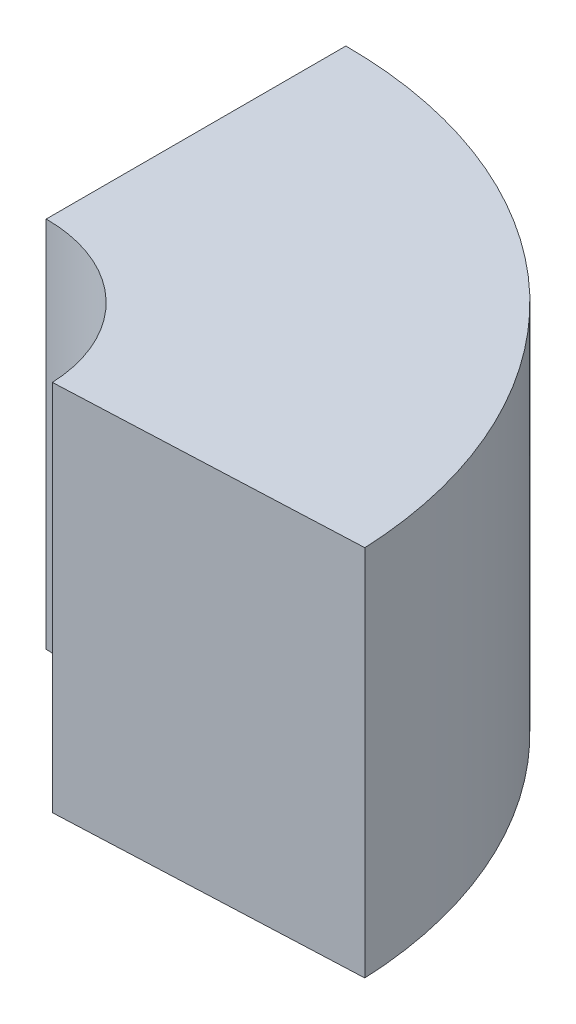
ISO-10303-21;
HEADER;
FILE_DESCRIPTION(('STEP AP214'),'2;1');
FILE_NAME('part.step','',(''),(''),'','','');
FILE_SCHEMA(('AUTOMOTIVE_DESIGN { 1 0 10303 214 1 1 1 1 }'));
ENDSEC;
DATA;
#1=APPLICATION_CONTEXT('core data for automotive mechanical design processes');
#2=APPLICATION_PROTOCOL_DEFINITION('international standard','automotive_design',2000,#1);
#3=PRODUCT_CONTEXT('',#1,'mechanical');
#4=PRODUCT('Part','Part','',(#3));
#5=PRODUCT_RELATED_PRODUCT_CATEGORY('part','',(#4));
#6=PRODUCT_DEFINITION_FORMATION('','',#4);
#7=PRODUCT_DEFINITION_CONTEXT('part definition',#1,'design');
#8=PRODUCT_DEFINITION('design','',#6,#7);
#9=PRODUCT_DEFINITION_SHAPE('','',#8);
#10=(LENGTH_UNIT() NAMED_UNIT(*) SI_UNIT(.MILLI.,.METRE.));
#11=(NAMED_UNIT(*) PLANE_ANGLE_UNIT() SI_UNIT($,.RADIAN.));
#12=(NAMED_UNIT(*) SI_UNIT($,.STERADIAN.) SOLID_ANGLE_UNIT());
#13=UNCERTAINTY_MEASURE_WITH_UNIT(LENGTH_MEASURE(1.E-05),#10,'distance_accuracy_value','');
#14=(GEOMETRIC_REPRESENTATION_CONTEXT(3) GLOBAL_UNCERTAINTY_ASSIGNED_CONTEXT((#13)) GLOBAL_UNIT_ASSIGNED_CONTEXT((#10,
#11,#12)) REPRESENTATION_CONTEXT('',''));
#15=CARTESIAN_POINT('',(0.,0.,0.));
#16=DIRECTION('',(0.,0.,1.));
#17=DIRECTION('',(1.,0.,0.));
#18=AXIS2_PLACEMENT_3D('',#15,#16,#17);
#19=CARTESIAN_POINT('',(0.,-21.9,-9.3));
#20=DIRECTION('',(0.,1.,0.));
#21=DIRECTION('',(0.,0.,1.));
#22=AXIS2_PLACEMENT_3D('',#19,#20,#21);
#23=CYLINDRICAL_SURFACE('',#22,11.3);
#24=CARTESIAN_POINT('',(0.,12.2,-9.3));
#25=DIRECTION('',(0.,1.,0.));
#26=DIRECTION('',(0.,0.,1.));
#27=AXIS2_PLACEMENT_3D('',#24,#25,#26);
#28=CIRCLE('',#27,11.3);
#29=CARTESIAN_POINT('',(11.289244903875,12.2,-9.7928990772283));
#30=VERTEX_POINT('',#29);
#31=CARTESIAN_POINT('',(0.,12.2,-20.6));
#32=VERTEX_POINT('',#31);
#33=EDGE_CURVE('E11',#30,#32,#28,.T.);
#34=ORIENTED_EDGE('',*,*,#33,.T.);
#35=DIRECTION('',(0.,-1.,0.));
#36=VECTOR('',#35,1.);
#37=CARTESIAN_POINT('',(0.,-16.9,-20.6));
#38=LINE('',#37,#36);
#39=CARTESIAN_POINT('',(0.,-16.9,-20.6));
#40=VERTEX_POINT('',#39);
#41=EDGE_CURVE('E98',#32,#40,#38,.T.);
#42=ORIENTED_EDGE('',*,*,#41,.T.);
#43=CARTESIAN_POINT('',(0.,-16.9,-9.3));
#44=DIRECTION('',(0.,1.,0.));
#45=DIRECTION('',(0.,0.,1.));
#46=AXIS2_PLACEMENT_3D('',#43,#44,#45);
#47=CIRCLE('',#46,11.3);
#48=CARTESIAN_POINT('',(11.289244903875,-16.9,-9.7928990772283));
#49=VERTEX_POINT('',#48);
#50=EDGE_CURVE('E83',#49,#40,#47,.T.);
#51=ORIENTED_EDGE('',*,*,#50,.F.);
#52=DIRECTION('',(0.,-1.,0.));
#53=VECTOR('',#52,1.);
#54=CARTESIAN_POINT('',(11.289244903875,-16.9,-9.7928990772283));
#55=LINE('',#54,#53);
#56=EDGE_CURVE('E109',#30,#49,#55,.T.);
#57=ORIENTED_EDGE('',*,*,#56,.F.);
#58=EDGE_LOOP('',(#34,#42,#51,#57));
#59=FACE_BOUND('',#58,.T.);
#60=ADVANCED_FACE('F41',(#59),#23,.F.);
#61=CARTESIAN_POINT('',(11.289244903875,12.2,-9.7928990772283));
#62=DIRECTION('',(0.,-1.,0.));
#63=DIRECTION('',(0.,0.,-1.));
#64=AXIS2_PLACEMENT_3D('',#61,#62,#63);
#65=PLANE('',#64);
#66=CARTESIAN_POINT('',(0.,12.2,-9.3));
#67=DIRECTION('',(0.,1.,0.));
#68=DIRECTION('',(0.,0.,1.));
#69=AXIS2_PLACEMENT_3D('',#66,#67,#68);
#70=CIRCLE('',#69,34.7);
#71=CARTESIAN_POINT('',(34.6669732888905,12.2,-10.8135927415772));
#72=VERTEX_POINT('',#71);
#73=CARTESIAN_POINT('',(0.,12.2,-44.));
#74=VERTEX_POINT('',#73);
#75=EDGE_CURVE('E47',#72,#74,#70,.T.);
#76=ORIENTED_EDGE('',*,*,#75,.T.);
#77=DIRECTION('',(0.,0.,1.));
#78=VECTOR('',#77,1.);
#79=CARTESIAN_POINT('',(0.,12.2,-20.6));
#80=LINE('',#79,#78);
#81=EDGE_CURVE('E103',#74,#32,#80,.T.);
#82=ORIENTED_EDGE('',*,*,#81,.T.);
#83=ORIENTED_EDGE('',*,*,#33,.F.);
#84=DIRECTION('',(-0.999048221581858,0.,0.043619387365336));
#85=VECTOR('',#84,1.);
#86=CARTESIAN_POINT('',(11.289244903875,12.2,-9.7928990772283));
#87=LINE('',#86,#85);
#88=EDGE_CURVE('E93',#72,#30,#87,.T.);
#89=ORIENTED_EDGE('',*,*,#88,.F.);
#90=EDGE_LOOP('',(#76,#82,#83,#89));
#91=FACE_BOUND('',#90,.T.);
#92=ADVANCED_FACE('F43',(#91),#65,.F.);
#93=CARTESIAN_POINT('',(0.,-21.9,-9.3));
#94=DIRECTION('',(0.,1.,0.));
#95=DIRECTION('',(0.,0.,1.));
#96=AXIS2_PLACEMENT_3D('',#93,#94,#95);
#97=CYLINDRICAL_SURFACE('',#96,34.7);
#98=CARTESIAN_POINT('',(0.,-16.9,-9.3));
#99=DIRECTION('',(0.,1.,0.));
#100=DIRECTION('',(0.,0.,1.));
#101=AXIS2_PLACEMENT_3D('',#98,#99,#100);
#102=CIRCLE('',#101,34.7);
#103=CARTESIAN_POINT('',(34.6669732888905,-16.9,-10.8135927415772));
#104=VERTEX_POINT('',#103);
#105=CARTESIAN_POINT('',(0.,-16.9,-44.));
#106=VERTEX_POINT('',#105);
#107=EDGE_CURVE('E95',#104,#106,#102,.T.);
#108=ORIENTED_EDGE('',*,*,#107,.T.);
#109=DIRECTION('',(0.,1.,0.));
#110=VECTOR('',#109,1.);
#111=CARTESIAN_POINT('',(0.,-16.9,-44.));
#112=LINE('',#111,#110);
#113=EDGE_CURVE('E99',#106,#74,#112,.T.);
#114=ORIENTED_EDGE('',*,*,#113,.T.);
#115=ORIENTED_EDGE('',*,*,#75,.F.);
#116=DIRECTION('',(0.,1.,0.));
#117=VECTOR('',#116,1.);
#118=CARTESIAN_POINT('',(34.6669732888905,-16.9,-10.8135927415772));
#119=LINE('',#118,#117);
#120=EDGE_CURVE('E108',#104,#72,#119,.T.);
#121=ORIENTED_EDGE('',*,*,#120,.F.);
#122=EDGE_LOOP('',(#108,#114,#115,#121));
#123=FACE_BOUND('',#122,.T.);
#124=ADVANCED_FACE('F111',(#123),#97,.T.);
#125=CARTESIAN_POINT('',(11.289244903875,-16.9,-9.7928990772283));
#126=DIRECTION('',(0.,1.,0.));
#127=DIRECTION('',(0.,0.,1.));
#128=AXIS2_PLACEMENT_3D('',#125,#126,#127);
#129=PLANE('',#128);
#130=DIRECTION('',(0.999048221581858,0.,-0.043619387365336));
#131=VECTOR('',#130,1.);
#132=CARTESIAN_POINT('',(11.289244903875,-16.9,-9.7928990772283));
#133=LINE('',#132,#131);
#134=EDGE_CURVE('E90',#49,#104,#133,.T.);
#135=ORIENTED_EDGE('',*,*,#134,.F.);
#136=ORIENTED_EDGE('',*,*,#50,.T.);
#137=DIRECTION('',(0.,0.,-1.));
#138=VECTOR('',#137,1.);
#139=CARTESIAN_POINT('',(0.,-16.9,-20.6));
#140=LINE('',#139,#138);
#141=EDGE_CURVE('E84',#40,#106,#140,.T.);
#142=ORIENTED_EDGE('',*,*,#141,.T.);
#143=ORIENTED_EDGE('',*,*,#107,.F.);
#144=EDGE_LOOP('',(#135,#136,#142,#143));
#145=FACE_BOUND('',#144,.T.);
#146=ADVANCED_FACE('F81',(#145),#129,.F.);
#147=CARTESIAN_POINT('',(-9.29114846071128,0.,-8.89433969750237));
#148=DIRECTION('',(-0.043619387365336,0.,-0.999048221581858));
#149=DIRECTION('',(-0.999048221581858,0.,0.043619387365336));
#150=AXIS2_PLACEMENT_3D('',#147,#148,#149);
#151=PLANE('',#150);
#152=ORIENTED_EDGE('',*,*,#56,.T.);
#153=ORIENTED_EDGE('',*,*,#134,.T.);
#154=ORIENTED_EDGE('',*,*,#120,.T.);
#155=ORIENTED_EDGE('',*,*,#88,.T.);
#156=EDGE_LOOP('',(#152,#153,#154,#155));
#157=FACE_BOUND('',#156,.T.);
#158=ADVANCED_FACE('F113',(#157),#151,.F.);
#159=CARTESIAN_POINT('',(0.,0.,0.));
#160=DIRECTION('',(-1.,0.,0.));
#161=DIRECTION('',(0.,0.,1.));
#162=AXIS2_PLACEMENT_3D('',#159,#160,#161);
#163=PLANE('',#162);
#164=ORIENTED_EDGE('',*,*,#41,.F.);
#165=ORIENTED_EDGE('',*,*,#81,.F.);
#166=ORIENTED_EDGE('',*,*,#113,.F.);
#167=ORIENTED_EDGE('',*,*,#141,.F.);
#168=EDGE_LOOP('',(#164,#165,#166,#167));
#169=FACE_BOUND('',#168,.T.);
#170=ADVANCED_FACE('F100',(#169),#163,.T.);
#171=CLOSED_SHELL('',(#60,#92,#124,#146,#158,#170));
#172=MANIFOLD_SOLID_BREP('B2',#171);
#173=ADVANCED_BREP_SHAPE_REPRESENTATION('',(#18,#172),#14);
#174=SHAPE_DEFINITION_REPRESENTATION(#9,#173);
ENDSEC;
END-ISO-10303-21;
